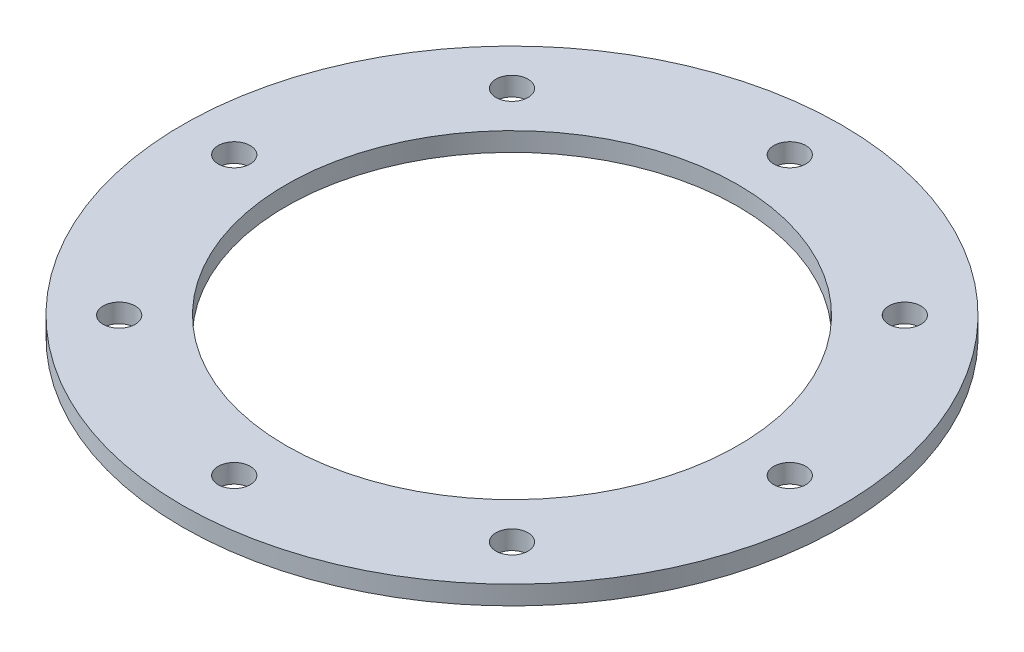
ISO-10303-21;
HEADER;
FILE_DESCRIPTION(('STEP AP214'),'2;1');
FILE_NAME('part.step','',(''),(''),'','','');
FILE_SCHEMA(('AUTOMOTIVE_DESIGN { 1 0 10303 214 1 1 1 1 }'));
ENDSEC;
DATA;
#1=APPLICATION_CONTEXT('core data for automotive mechanical design processes');
#2=APPLICATION_PROTOCOL_DEFINITION('international standard','automotive_design',2000,#1);
#3=PRODUCT_CONTEXT('',#1,'mechanical');
#4=PRODUCT('Part','Part','',(#3));
#5=PRODUCT_RELATED_PRODUCT_CATEGORY('part','',(#4));
#6=PRODUCT_DEFINITION_FORMATION('','',#4);
#7=PRODUCT_DEFINITION_CONTEXT('part definition',#1,'design');
#8=PRODUCT_DEFINITION('design','',#6,#7);
#9=PRODUCT_DEFINITION_SHAPE('','',#8);
#10=(LENGTH_UNIT() NAMED_UNIT(*) SI_UNIT(.MILLI.,.METRE.));
#11=(NAMED_UNIT(*) PLANE_ANGLE_UNIT() SI_UNIT($,.RADIAN.));
#12=(NAMED_UNIT(*) SI_UNIT($,.STERADIAN.) SOLID_ANGLE_UNIT());
#13=UNCERTAINTY_MEASURE_WITH_UNIT(LENGTH_MEASURE(1.E-05),#10,'distance_accuracy_value','');
#14=(GEOMETRIC_REPRESENTATION_CONTEXT(3) GLOBAL_UNCERTAINTY_ASSIGNED_CONTEXT((#13)) GLOBAL_UNIT_ASSIGNED_CONTEXT((#10,
#11,#12)) REPRESENTATION_CONTEXT('',''));
#15=CARTESIAN_POINT('',(0.,0.,0.));
#16=DIRECTION('',(0.,0.,1.));
#17=DIRECTION('',(1.,0.,0.));
#18=AXIS2_PLACEMENT_3D('',#15,#16,#17);
#19=CARTESIAN_POINT('',(0.,4.,0.));
#20=DIRECTION('',(0.,1.,0.));
#21=DIRECTION('',(0.,0.,1.));
#22=AXIS2_PLACEMENT_3D('',#19,#20,#21);
#23=PLANE('',#22);
#24=CARTESIAN_POINT('',(6.08166723207302E-13,4.00000000000006,-59.0000000000002));
#25=DIRECTION('',(0.,1.,0.));
#26=DIRECTION('',(0.,0.,1.));
#27=AXIS2_PLACEMENT_3D('',#24,#25,#26);
#28=CIRCLE('',#27,3.4);
#29=CARTESIAN_POINT('',(6.08732936949861E-13,4.00000000000006,-55.6000000000002));
#30=VERTEX_POINT('',#29);
#31=EDGE_CURVE('E107',#30,#30,#28,.T.);
#32=ORIENTED_EDGE('',*,*,#31,.F.);
#33=EDGE_LOOP('',(#32));
#34=FACE_BOUND('',#33,.T.);
#35=CARTESIAN_POINT('',(-59.,4.00000000000011,-5.55111512312578E-13));
#36=DIRECTION('',(0.,1.,0.));
#37=DIRECTION('',(0.,0.,1.));
#38=AXIS2_PLACEMENT_3D('',#35,#36,#37);
#39=CIRCLE('',#38,3.4);
#40=CARTESIAN_POINT('',(-59.,4.00000000000011,3.39999999999945));
#41=VERTEX_POINT('',#40);
#42=EDGE_CURVE('E91',#41,#41,#39,.T.);
#43=ORIENTED_EDGE('',*,*,#42,.F.);
#44=EDGE_LOOP('',(#43));
#45=FACE_BOUND('',#44,.T.);
#46=CARTESIAN_POINT('',(-1.96171925223812E-13,4.,59.));
#47=DIRECTION('',(0.,1.,0.));
#48=DIRECTION('',(0.,0.,1.));
#49=AXIS2_PLACEMENT_3D('',#46,#47,#48);
#50=CIRCLE('',#49,3.4);
#51=CARTESIAN_POINT('',(-1.95605711481253E-13,4.,62.4));
#52=VERTEX_POINT('',#51);
#53=EDGE_CURVE('E75',#52,#52,#50,.T.);
#54=ORIENTED_EDGE('',*,*,#53,.F.);
#55=EDGE_LOOP('',(#54));
#56=FACE_BOUND('',#55,.T.);
#57=CARTESIAN_POINT('',(59.,4.,0.));
#58=DIRECTION('',(0.,1.,0.));
#59=DIRECTION('',(0.,0.,1.));
#60=AXIS2_PLACEMENT_3D('',#57,#58,#59);
#61=CIRCLE('',#60,3.4);
#62=CARTESIAN_POINT('',(59.,4.,3.39999999999998));
#63=VERTEX_POINT('',#62);
#64=EDGE_CURVE('E59',#63,#63,#61,.T.);
#65=ORIENTED_EDGE('',*,*,#64,.F.);
#66=EDGE_LOOP('',(#65));
#67=FACE_BOUND('',#66,.T.);
#68=CARTESIAN_POINT('',(0.,4.,0.));
#69=DIRECTION('',(0.,1.,0.));
#70=DIRECTION('',(0.,0.,1.));
#71=AXIS2_PLACEMENT_3D('',#68,#69,#70);
#72=CIRCLE('',#71,70.);
#73=CARTESIAN_POINT('',(0.,4.,70.0000000000001));
#74=VERTEX_POINT('',#73);
#75=EDGE_CURVE('E10',#74,#74,#72,.T.);
#76=ORIENTED_EDGE('',*,*,#75,.T.);
#77=EDGE_LOOP('',(#76));
#78=FACE_BOUND('',#77,.T.);
#79=CARTESIAN_POINT('',(0.,4.,0.));
#80=DIRECTION('',(0.,1.,0.));
#81=DIRECTION('',(0.,0.,1.));
#82=AXIS2_PLACEMENT_3D('',#79,#80,#81);
#83=CIRCLE('',#82,48.);
#84=CARTESIAN_POINT('',(0.,4.,48.0000000000001));
#85=VERTEX_POINT('',#84);
#86=EDGE_CURVE('E53',#85,#85,#83,.T.);
#87=ORIENTED_EDGE('',*,*,#86,.F.);
#88=EDGE_LOOP('',(#87));
#89=FACE_BOUND('',#88,.T.);
#90=CARTESIAN_POINT('',(41.7193000900063,4.00000000000011,41.7193000900064));
#91=DIRECTION('',(0.,1.,0.));
#92=DIRECTION('',(0.,0.,1.));
#93=AXIS2_PLACEMENT_3D('',#90,#91,#92);
#94=CIRCLE('',#93,3.4);
#95=CARTESIAN_POINT('',(41.7193000900063,4.00000000000011,45.1193000900064));
#96=VERTEX_POINT('',#95);
#97=EDGE_CURVE('E67',#96,#96,#94,.T.);
#98=ORIENTED_EDGE('',*,*,#97,.F.);
#99=EDGE_LOOP('',(#98));
#100=FACE_BOUND('',#99,.T.);
#101=CARTESIAN_POINT('',(-41.7193000900065,4.00000000000011,41.7193000900062));
#102=DIRECTION('',(0.,1.,0.));
#103=DIRECTION('',(0.,0.,1.));
#104=AXIS2_PLACEMENT_3D('',#101,#102,#103);
#105=CIRCLE('',#104,3.4);
#106=CARTESIAN_POINT('',(-41.7193000900065,4.00000000000011,45.1193000900062));
#107=VERTEX_POINT('',#106);
#108=EDGE_CURVE('E83',#107,#107,#105,.T.);
#109=ORIENTED_EDGE('',*,*,#108,.F.);
#110=EDGE_LOOP('',(#109));
#111=FACE_BOUND('',#110,.T.);
#112=CARTESIAN_POINT('',(-41.7193000900059,4.00000000000011,-41.7193000900068));
#113=DIRECTION('',(0.,1.,0.));
#114=DIRECTION('',(0.,0.,1.));
#115=AXIS2_PLACEMENT_3D('',#112,#113,#114);
#116=CIRCLE('',#115,3.4);
#117=CARTESIAN_POINT('',(-41.7193000900059,4.00000000000011,-38.3193000900068));
#118=VERTEX_POINT('',#117);
#119=EDGE_CURVE('E99',#118,#118,#116,.T.);
#120=ORIENTED_EDGE('',*,*,#119,.F.);
#121=EDGE_LOOP('',(#120));
#122=FACE_BOUND('',#121,.T.);
#123=CARTESIAN_POINT('',(41.7193000900068,4.,-41.7193000900058));
#124=DIRECTION('',(0.,1.,0.));
#125=DIRECTION('',(0.,0.,1.));
#126=AXIS2_PLACEMENT_3D('',#123,#124,#125);
#127=CIRCLE('',#126,3.4);
#128=CARTESIAN_POINT('',(41.7193000900068,4.,-38.3193000900058));
#129=VERTEX_POINT('',#128);
#130=EDGE_CURVE('E115',#129,#129,#127,.T.);
#131=ORIENTED_EDGE('',*,*,#130,.F.);
#132=EDGE_LOOP('',(#131));
#133=FACE_BOUND('',#132,.T.);
#134=ADVANCED_FACE('F39',(#34,#45,#56,#67,#78,#89,#100,#111,#122,#133),#23,.T.);
#135=CARTESIAN_POINT('',(0.,0.,0.));
#136=DIRECTION('',(0.,1.,0.));
#137=DIRECTION('',(0.,0.,1.));
#138=AXIS2_PLACEMENT_3D('',#135,#136,#137);
#139=PLANE('',#138);
#140=CARTESIAN_POINT('',(0.,0.,0.));
#141=DIRECTION('',(0.,1.,0.));
#142=DIRECTION('',(0.,0.,1.));
#143=AXIS2_PLACEMENT_3D('',#140,#141,#142);
#144=CIRCLE('',#143,70.);
#145=CARTESIAN_POINT('',(0.,0.,70.0000000000001));
#146=VERTEX_POINT('',#145);
#147=EDGE_CURVE('E43',#146,#146,#144,.T.);
#148=ORIENTED_EDGE('',*,*,#147,.F.);
#149=EDGE_LOOP('',(#148));
#150=FACE_BOUND('',#149,.T.);
#151=CARTESIAN_POINT('',(0.,0.,0.));
#152=DIRECTION('',(0.,1.,0.));
#153=DIRECTION('',(0.,0.,1.));
#154=AXIS2_PLACEMENT_3D('',#151,#152,#153);
#155=CIRCLE('',#154,48.);
#156=CARTESIAN_POINT('',(0.,0.,48.0000000000001));
#157=VERTEX_POINT('',#156);
#158=EDGE_CURVE('E55',#157,#157,#155,.T.);
#159=ORIENTED_EDGE('',*,*,#158,.T.);
#160=EDGE_LOOP('',(#159));
#161=FACE_BOUND('',#160,.T.);
#162=CARTESIAN_POINT('',(59.,0.,0.));
#163=DIRECTION('',(0.,1.,0.));
#164=DIRECTION('',(0.,0.,1.));
#165=AXIS2_PLACEMENT_3D('',#162,#163,#164);
#166=CIRCLE('',#165,3.4);
#167=CARTESIAN_POINT('',(59.,0.,3.40000000000001));
#168=VERTEX_POINT('',#167);
#169=EDGE_CURVE('E63',#168,#168,#166,.T.);
#170=ORIENTED_EDGE('',*,*,#169,.T.);
#171=EDGE_LOOP('',(#170));
#172=FACE_BOUND('',#171,.T.);
#173=CARTESIAN_POINT('',(41.7193000900063,0.,41.7193000900064));
#174=DIRECTION('',(0.,1.,0.));
#175=DIRECTION('',(0.,0.,1.));
#176=AXIS2_PLACEMENT_3D('',#173,#174,#175);
#177=CIRCLE('',#176,3.4);
#178=CARTESIAN_POINT('',(41.7193000900063,0.,45.1193000900064));
#179=VERTEX_POINT('',#178);
#180=EDGE_CURVE('E71',#179,#179,#177,.T.);
#181=ORIENTED_EDGE('',*,*,#180,.T.);
#182=EDGE_LOOP('',(#181));
#183=FACE_BOUND('',#182,.T.);
#184=CARTESIAN_POINT('',(-1.96171925223812E-13,0.,59.0000000000001));
#185=DIRECTION('',(0.,1.,0.));
#186=DIRECTION('',(0.,0.,1.));
#187=AXIS2_PLACEMENT_3D('',#184,#185,#186);
#188=CIRCLE('',#187,3.4);
#189=CARTESIAN_POINT('',(-1.95605711481253E-13,0.,62.4000000000001));
#190=VERTEX_POINT('',#189);
#191=EDGE_CURVE('E79',#190,#190,#188,.T.);
#192=ORIENTED_EDGE('',*,*,#191,.T.);
#193=EDGE_LOOP('',(#192));
#194=FACE_BOUND('',#193,.T.);
#195=CARTESIAN_POINT('',(-41.7193000900065,0.,41.7193000900061));
#196=DIRECTION('',(0.,1.,0.));
#197=DIRECTION('',(0.,0.,1.));
#198=AXIS2_PLACEMENT_3D('',#195,#196,#197);
#199=CIRCLE('',#198,3.4);
#200=CARTESIAN_POINT('',(-41.7193000900065,0.,45.1193000900061));
#201=VERTEX_POINT('',#200);
#202=EDGE_CURVE('E87',#201,#201,#199,.T.);
#203=ORIENTED_EDGE('',*,*,#202,.T.);
#204=EDGE_LOOP('',(#203));
#205=FACE_BOUND('',#204,.T.);
#206=CARTESIAN_POINT('',(-59.,1.11022302462516E-13,-5.55111512312578E-13));
#207=DIRECTION('',(0.,1.,0.));
#208=DIRECTION('',(0.,0.,1.));
#209=AXIS2_PLACEMENT_3D('',#206,#207,#208);
#210=CIRCLE('',#209,3.4);
#211=CARTESIAN_POINT('',(-59.,1.10833564548329E-13,3.39999999999945));
#212=VERTEX_POINT('',#211);
#213=EDGE_CURVE('E95',#212,#212,#210,.T.);
#214=ORIENTED_EDGE('',*,*,#213,.T.);
#215=EDGE_LOOP('',(#214));
#216=FACE_BOUND('',#215,.T.);
#217=CARTESIAN_POINT('',(-41.7193000900059,0.,-41.7193000900067));
#218=DIRECTION('',(0.,1.,0.));
#219=DIRECTION('',(0.,0.,1.));
#220=AXIS2_PLACEMENT_3D('',#217,#218,#219);
#221=CIRCLE('',#220,3.4);
#222=CARTESIAN_POINT('',(-41.7193000900059,0.,-38.3193000900067));
#223=VERTEX_POINT('',#222);
#224=EDGE_CURVE('E103',#223,#223,#221,.T.);
#225=ORIENTED_EDGE('',*,*,#224,.T.);
#226=EDGE_LOOP('',(#225));
#227=FACE_BOUND('',#226,.T.);
#228=CARTESIAN_POINT('',(6.08166723207302E-13,1.66533453693773E-13,-59.0000000000002));
#229=DIRECTION('',(0.,1.,0.));
#230=DIRECTION('',(0.,0.,1.));
#231=AXIS2_PLACEMENT_3D('',#228,#229,#230);
#232=CIRCLE('',#231,3.4);
#233=CARTESIAN_POINT('',(6.08732936949861E-13,1.66344715779587E-13,-55.6000000000002));
#234=VERTEX_POINT('',#233);
#235=EDGE_CURVE('E111',#234,#234,#232,.T.);
#236=ORIENTED_EDGE('',*,*,#235,.T.);
#237=EDGE_LOOP('',(#236));
#238=FACE_BOUND('',#237,.T.);
#239=CARTESIAN_POINT('',(41.7193000900068,0.,-41.7193000900059));
#240=DIRECTION('',(0.,1.,0.));
#241=DIRECTION('',(0.,0.,1.));
#242=AXIS2_PLACEMENT_3D('',#239,#240,#241);
#243=CIRCLE('',#242,3.4);
#244=CARTESIAN_POINT('',(41.7193000900068,0.,-38.3193000900059));
#245=VERTEX_POINT('',#244);
#246=EDGE_CURVE('E119',#245,#245,#243,.T.);
#247=ORIENTED_EDGE('',*,*,#246,.T.);
#248=EDGE_LOOP('',(#247));
#249=FACE_BOUND('',#248,.T.);
#250=ADVANCED_FACE('F132',(#150,#161,#172,#183,#194,#205,#216,#227,#238,#249),#139,.F.);
#251=CARTESIAN_POINT('',(0.,4.,0.));
#252=DIRECTION('',(0.,-1.,0.));
#253=DIRECTION('',(0.,0.,-1.));
#254=AXIS2_PLACEMENT_3D('',#251,#252,#253);
#255=CYLINDRICAL_SURFACE('',#254,70.);
#256=ORIENTED_EDGE('',*,*,#75,.F.);
#257=EDGE_LOOP('',(#256));
#258=FACE_BOUND('',#257,.T.);
#259=ORIENTED_EDGE('',*,*,#147,.T.);
#260=EDGE_LOOP('',(#259));
#261=FACE_BOUND('',#260,.T.);
#262=ADVANCED_FACE('F41',(#258,#261),#255,.T.);
#263=CARTESIAN_POINT('',(0.,4.,0.));
#264=DIRECTION('',(0.,-1.,0.));
#265=DIRECTION('',(0.,0.,-1.));
#266=AXIS2_PLACEMENT_3D('',#263,#264,#265);
#267=CYLINDRICAL_SURFACE('',#266,48.);
#268=ORIENTED_EDGE('',*,*,#86,.T.);
#269=EDGE_LOOP('',(#268));
#270=FACE_BOUND('',#269,.T.);
#271=ORIENTED_EDGE('',*,*,#158,.F.);
#272=EDGE_LOOP('',(#271));
#273=FACE_BOUND('',#272,.T.);
#274=ADVANCED_FACE('F142',(#270,#273),#267,.F.);
#275=CARTESIAN_POINT('',(59.,4.,0.));
#276=DIRECTION('',(0.,-1.,0.));
#277=DIRECTION('',(0.,0.,-1.));
#278=AXIS2_PLACEMENT_3D('',#275,#276,#277);
#279=CYLINDRICAL_SURFACE('',#278,3.4);
#280=ORIENTED_EDGE('',*,*,#64,.T.);
#281=EDGE_LOOP('',(#280));
#282=FACE_BOUND('',#281,.T.);
#283=ORIENTED_EDGE('',*,*,#169,.F.);
#284=EDGE_LOOP('',(#283));
#285=FACE_BOUND('',#284,.T.);
#286=ADVANCED_FACE('F145',(#282,#285),#279,.F.);
#287=CARTESIAN_POINT('',(41.7193000900063,4.00000000000011,41.7193000900064));
#288=DIRECTION('',(0.,-1.,0.));
#289=DIRECTION('',(0.,0.,-1.));
#290=AXIS2_PLACEMENT_3D('',#287,#288,#289);
#291=CYLINDRICAL_SURFACE('',#290,3.4);
#292=ORIENTED_EDGE('',*,*,#97,.T.);
#293=EDGE_LOOP('',(#292));
#294=FACE_BOUND('',#293,.T.);
#295=ORIENTED_EDGE('',*,*,#180,.F.);
#296=EDGE_LOOP('',(#295));
#297=FACE_BOUND('',#296,.T.);
#298=ADVANCED_FACE('F149',(#294,#297),#291,.F.);
#299=CARTESIAN_POINT('',(-1.96171925223812E-13,4.,59.));
#300=DIRECTION('',(0.,-1.,0.));
#301=DIRECTION('',(0.,0.,-1.));
#302=AXIS2_PLACEMENT_3D('',#299,#300,#301);
#303=CYLINDRICAL_SURFACE('',#302,3.4);
#304=ORIENTED_EDGE('',*,*,#53,.T.);
#305=EDGE_LOOP('',(#304));
#306=FACE_BOUND('',#305,.T.);
#307=ORIENTED_EDGE('',*,*,#191,.F.);
#308=EDGE_LOOP('',(#307));
#309=FACE_BOUND('',#308,.T.);
#310=ADVANCED_FACE('F153',(#306,#309),#303,.F.);
#311=CARTESIAN_POINT('',(-41.7193000900065,4.00000000000011,41.7193000900062));
#312=DIRECTION('',(0.,-1.,0.));
#313=DIRECTION('',(0.,0.,-1.));
#314=AXIS2_PLACEMENT_3D('',#311,#312,#313);
#315=CYLINDRICAL_SURFACE('',#314,3.4);
#316=ORIENTED_EDGE('',*,*,#108,.T.);
#317=EDGE_LOOP('',(#316));
#318=FACE_BOUND('',#317,.T.);
#319=ORIENTED_EDGE('',*,*,#202,.F.);
#320=EDGE_LOOP('',(#319));
#321=FACE_BOUND('',#320,.T.);
#322=ADVANCED_FACE('F157',(#318,#321),#315,.F.);
#323=CARTESIAN_POINT('',(-59.,4.00000000000011,-5.55111512312578E-13));
#324=DIRECTION('',(0.,-1.,0.));
#325=DIRECTION('',(0.,0.,-1.));
#326=AXIS2_PLACEMENT_3D('',#323,#324,#325);
#327=CYLINDRICAL_SURFACE('',#326,3.4);
#328=ORIENTED_EDGE('',*,*,#42,.T.);
#329=EDGE_LOOP('',(#328));
#330=FACE_BOUND('',#329,.T.);
#331=ORIENTED_EDGE('',*,*,#213,.F.);
#332=EDGE_LOOP('',(#331));
#333=FACE_BOUND('',#332,.T.);
#334=ADVANCED_FACE('F161',(#330,#333),#327,.F.);
#335=CARTESIAN_POINT('',(-41.7193000900059,4.00000000000011,-41.7193000900068));
#336=DIRECTION('',(0.,-1.,0.));
#337=DIRECTION('',(0.,0.,-1.));
#338=AXIS2_PLACEMENT_3D('',#335,#336,#337);
#339=CYLINDRICAL_SURFACE('',#338,3.4);
#340=ORIENTED_EDGE('',*,*,#119,.T.);
#341=EDGE_LOOP('',(#340));
#342=FACE_BOUND('',#341,.T.);
#343=ORIENTED_EDGE('',*,*,#224,.F.);
#344=EDGE_LOOP('',(#343));
#345=FACE_BOUND('',#344,.T.);
#346=ADVANCED_FACE('F165',(#342,#345),#339,.F.);
#347=CARTESIAN_POINT('',(6.08166723207302E-13,4.00000000000006,-59.0000000000002));
#348=DIRECTION('',(0.,-1.,0.));
#349=DIRECTION('',(0.,0.,-1.));
#350=AXIS2_PLACEMENT_3D('',#347,#348,#349);
#351=CYLINDRICAL_SURFACE('',#350,3.4);
#352=ORIENTED_EDGE('',*,*,#31,.T.);
#353=EDGE_LOOP('',(#352));
#354=FACE_BOUND('',#353,.T.);
#355=ORIENTED_EDGE('',*,*,#235,.F.);
#356=EDGE_LOOP('',(#355));
#357=FACE_BOUND('',#356,.T.);
#358=ADVANCED_FACE('F169',(#354,#357),#351,.F.);
#359=CARTESIAN_POINT('',(41.7193000900068,4.,-41.7193000900058));
#360=DIRECTION('',(0.,-1.,0.));
#361=DIRECTION('',(0.,0.,-1.));
#362=AXIS2_PLACEMENT_3D('',#359,#360,#361);
#363=CYLINDRICAL_SURFACE('',#362,3.4);
#364=ORIENTED_EDGE('',*,*,#130,.T.);
#365=EDGE_LOOP('',(#364));
#366=FACE_BOUND('',#365,.T.);
#367=ORIENTED_EDGE('',*,*,#246,.F.);
#368=EDGE_LOOP('',(#367));
#369=FACE_BOUND('',#368,.T.);
#370=ADVANCED_FACE('F128',(#366,#369),#363,.F.);
#371=CLOSED_SHELL('',(#134,#250,#262,#274,#286,#298,#310,#322,#334,#346,#358,#370));
#372=MANIFOLD_SOLID_BREP('B2',#371);
#373=ADVANCED_BREP_SHAPE_REPRESENTATION('',(#18,#372),#14);
#374=SHAPE_DEFINITION_REPRESENTATION(#9,#373);
ENDSEC;
END-ISO-10303-21;
